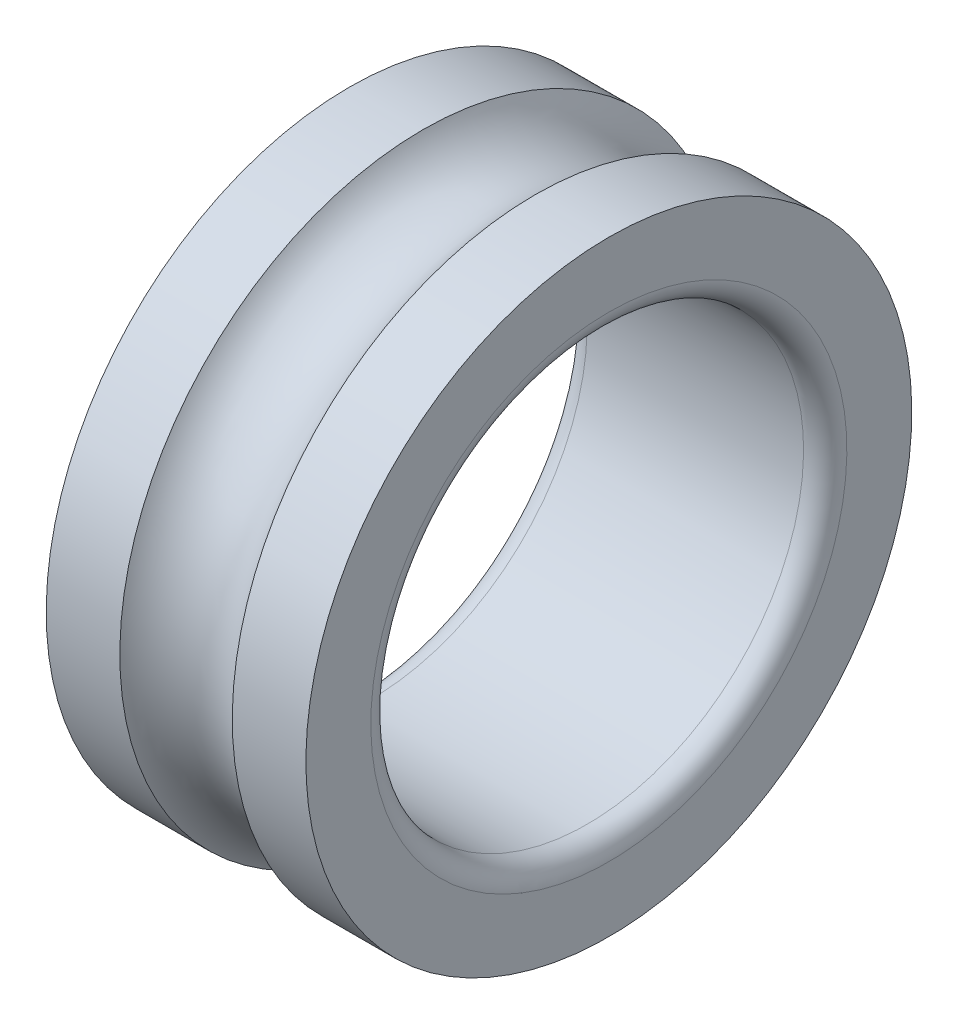
ISO-10303-21;
HEADER;
FILE_DESCRIPTION(('STEP AP214'),'2;1');
FILE_NAME('part.step','',(''),(''),'','','');
FILE_SCHEMA(('AUTOMOTIVE_DESIGN { 1 0 10303 214 1 1 1 1 }'));
ENDSEC;
DATA;
#1=APPLICATION_CONTEXT('core data for automotive mechanical design processes');
#2=APPLICATION_PROTOCOL_DEFINITION('international standard','automotive_design',2000,#1);
#3=PRODUCT_CONTEXT('',#1,'mechanical');
#4=PRODUCT('Part','Part','',(#3));
#5=PRODUCT_RELATED_PRODUCT_CATEGORY('part','',(#4));
#6=PRODUCT_DEFINITION_FORMATION('','',#4);
#7=PRODUCT_DEFINITION_CONTEXT('part definition',#1,'design');
#8=PRODUCT_DEFINITION('design','',#6,#7);
#9=PRODUCT_DEFINITION_SHAPE('','',#8);
#10=(LENGTH_UNIT() NAMED_UNIT(*) SI_UNIT(.MILLI.,.METRE.));
#11=(NAMED_UNIT(*) PLANE_ANGLE_UNIT() SI_UNIT($,.RADIAN.));
#12=(NAMED_UNIT(*) SI_UNIT($,.STERADIAN.) SOLID_ANGLE_UNIT());
#13=UNCERTAINTY_MEASURE_WITH_UNIT(LENGTH_MEASURE(1.E-05),#10,'distance_accuracy_value','');
#14=(GEOMETRIC_REPRESENTATION_CONTEXT(3) GLOBAL_UNCERTAINTY_ASSIGNED_CONTEXT((#13)) GLOBAL_UNIT_ASSIGNED_CONTEXT((#10,
#11,#12)) REPRESENTATION_CONTEXT('',''));
#15=CARTESIAN_POINT('',(0.,0.,0.));
#16=DIRECTION('',(0.,0.,1.));
#17=DIRECTION('',(1.,0.,0.));
#18=AXIS2_PLACEMENT_3D('',#15,#16,#17);
#19=CARTESIAN_POINT('',(5.,98.5,0.));
#20=DIRECTION('',(1.,0.,0.));
#21=DIRECTION('',(0.,1.,0.));
#22=AXIS2_PLACEMENT_3D('',#19,#20,#21);
#23=PLANE('',#22);
#24=CARTESIAN_POINT('',(5.,87.5,0.));
#25=DIRECTION('',(1.,0.,0.));
#26=DIRECTION('',(0.,1.,0.));
#27=AXIS2_PLACEMENT_3D('',#24,#25,#26);
#28=CIRCLE('',#27,14.);
#29=CARTESIAN_POINT('',(5.,101.5,0.));
#30=VERTEX_POINT('',#29);
#31=EDGE_CURVE('E10',#30,#30,#28,.T.);
#32=ORIENTED_EDGE('',*,*,#31,.T.);
#33=EDGE_LOOP('',(#32));
#34=FACE_BOUND('',#33,.T.);
#35=CARTESIAN_POINT('',(4.99999999999999,87.5,0.));
#36=DIRECTION('',(1.,0.,0.));
#37=DIRECTION('',(0.,1.,0.));
#38=AXIS2_PLACEMENT_3D('',#35,#36,#37);
#39=CIRCLE('',#38,11.);
#40=CARTESIAN_POINT('',(4.99999999999999,98.5,0.));
#41=VERTEX_POINT('',#40);
#42=EDGE_CURVE('E59',#41,#41,#39,.T.);
#43=ORIENTED_EDGE('',*,*,#42,.F.);
#44=EDGE_LOOP('',(#43));
#45=FACE_BOUND('',#44,.T.);
#46=ADVANCED_FACE('F31',(#34,#45),#23,.T.);
#47=CARTESIAN_POINT('',(20.,87.5,0.));
#48=DIRECTION('',(1.,0.,0.));
#49=DIRECTION('',(0.,1.,0.));
#50=AXIS2_PLACEMENT_3D('',#47,#48,#49);
#51=CYLINDRICAL_SURFACE('',#50,14.);
#52=CARTESIAN_POINT('',(1.59807621135331,87.5,0.));
#53=DIRECTION('',(1.,0.,0.));
#54=DIRECTION('',(0.,1.,0.));
#55=AXIS2_PLACEMENT_3D('',#52,#53,#54);
#56=CIRCLE('',#55,14.);
#57=CARTESIAN_POINT('',(1.59807621135332,101.5,0.));
#58=VERTEX_POINT('',#57);
#59=EDGE_CURVE('E37',#58,#58,#56,.T.);
#60=ORIENTED_EDGE('',*,*,#59,.T.);
#61=EDGE_LOOP('',(#60));
#62=FACE_BOUND('',#61,.T.);
#63=ORIENTED_EDGE('',*,*,#31,.F.);
#64=EDGE_LOOP('',(#63));
#65=FACE_BOUND('',#64,.T.);
#66=ADVANCED_FACE('F67',(#62,#65),#51,.T.);
#67=CARTESIAN_POINT('',(-1.,87.5,0.));
#68=DIRECTION('',(1.,0.,0.));
#69=DIRECTION('',(0.,1.,0.));
#70=AXIS2_PLACEMENT_3D('',#67,#68,#69);
#71=TOROIDAL_SURFACE('',#70,15.5,3.);
#72=CARTESIAN_POINT('',(-3.59807621135332,87.5,0.));
#73=DIRECTION('',(1.,0.,0.));
#74=DIRECTION('',(0.,1.,0.));
#75=AXIS2_PLACEMENT_3D('',#72,#73,#74);
#76=CIRCLE('',#75,14.);
#77=CARTESIAN_POINT('',(-3.59807621135331,101.5,0.));
#78=VERTEX_POINT('',#77);
#79=EDGE_CURVE('E41',#78,#78,#76,.T.);
#80=ORIENTED_EDGE('',*,*,#79,.T.);
#81=EDGE_LOOP('',(#80));
#82=FACE_BOUND('',#81,.T.);
#83=ORIENTED_EDGE('',*,*,#59,.F.);
#84=EDGE_LOOP('',(#83));
#85=FACE_BOUND('',#84,.T.);
#86=ADVANCED_FACE('F71',(#82,#85),#71,.F.);
#87=CARTESIAN_POINT('',(20.,87.5,0.));
#88=DIRECTION('',(1.,0.,0.));
#89=DIRECTION('',(0.,1.,0.));
#90=AXIS2_PLACEMENT_3D('',#87,#88,#89);
#91=CYLINDRICAL_SURFACE('',#90,14.);
#92=CARTESIAN_POINT('',(-7.,87.5,0.));
#93=DIRECTION('',(1.,0.,0.));
#94=DIRECTION('',(0.,1.,0.));
#95=AXIS2_PLACEMENT_3D('',#92,#93,#94);
#96=CIRCLE('',#95,14.);
#97=CARTESIAN_POINT('',(-7.,101.5,0.));
#98=VERTEX_POINT('',#97);
#99=EDGE_CURVE('E45',#98,#98,#96,.T.);
#100=ORIENTED_EDGE('',*,*,#99,.T.);
#101=EDGE_LOOP('',(#100));
#102=FACE_BOUND('',#101,.T.);
#103=ORIENTED_EDGE('',*,*,#79,.F.);
#104=EDGE_LOOP('',(#103));
#105=FACE_BOUND('',#104,.T.);
#106=ADVANCED_FACE('F75',(#102,#105),#91,.T.);
#107=CARTESIAN_POINT('',(-7.,98.5,0.));
#108=DIRECTION('',(-1.,0.,0.));
#109=DIRECTION('',(0.,-1.,0.));
#110=AXIS2_PLACEMENT_3D('',#107,#108,#109);
#111=PLANE('',#110);
#112=CARTESIAN_POINT('',(-7.,87.5,0.));
#113=DIRECTION('',(1.,0.,0.));
#114=DIRECTION('',(0.,1.,0.));
#115=AXIS2_PLACEMENT_3D('',#112,#113,#114);
#116=CIRCLE('',#115,11.);
#117=CARTESIAN_POINT('',(-7.,98.5,0.));
#118=VERTEX_POINT('',#117);
#119=EDGE_CURVE('E50',#118,#118,#116,.T.);
#120=ORIENTED_EDGE('',*,*,#119,.T.);
#121=EDGE_LOOP('',(#120));
#122=FACE_BOUND('',#121,.T.);
#123=ORIENTED_EDGE('',*,*,#99,.F.);
#124=EDGE_LOOP('',(#123));
#125=FACE_BOUND('',#124,.T.);
#126=ADVANCED_FACE('F82',(#122,#125),#111,.T.);
#127=CARTESIAN_POINT('',(-6.,87.5,0.));
#128=DIRECTION('',(1.,0.,0.));
#129=DIRECTION('',(0.,1.,0.));
#130=AXIS2_PLACEMENT_3D('',#127,#128,#129);
#131=TOROIDAL_SURFACE('',#130,11.,1.);
#132=CARTESIAN_POINT('',(-6.,87.5,0.));
#133=DIRECTION('',(1.,0.,0.));
#134=DIRECTION('',(0.,1.,0.));
#135=AXIS2_PLACEMENT_3D('',#132,#133,#134);
#136=CIRCLE('',#135,9.99999999999998);
#137=CARTESIAN_POINT('',(-5.99999999999999,97.5,0.));
#138=VERTEX_POINT('',#137);
#139=EDGE_CURVE('E53',#138,#138,#136,.T.);
#140=ORIENTED_EDGE('',*,*,#139,.T.);
#141=EDGE_LOOP('',(#140));
#142=FACE_BOUND('',#141,.T.);
#143=ORIENTED_EDGE('',*,*,#119,.F.);
#144=EDGE_LOOP('',(#143));
#145=FACE_BOUND('',#144,.T.);
#146=ADVANCED_FACE('F86',(#142,#145),#131,.T.);
#147=CARTESIAN_POINT('',(20.,87.5,0.));
#148=DIRECTION('',(1.,0.,0.));
#149=DIRECTION('',(0.,1.,0.));
#150=AXIS2_PLACEMENT_3D('',#147,#148,#149);
#151=CYLINDRICAL_SURFACE('',#150,9.99999999999999);
#152=CARTESIAN_POINT('',(4.,87.5,0.));
#153=DIRECTION('',(1.,0.,0.));
#154=DIRECTION('',(0.,1.,0.));
#155=AXIS2_PLACEMENT_3D('',#152,#153,#154);
#156=CIRCLE('',#155,10.);
#157=CARTESIAN_POINT('',(4.00000000000001,97.5,0.));
#158=VERTEX_POINT('',#157);
#159=EDGE_CURVE('E56',#158,#158,#156,.T.);
#160=ORIENTED_EDGE('',*,*,#159,.T.);
#161=EDGE_LOOP('',(#160));
#162=FACE_BOUND('',#161,.T.);
#163=ORIENTED_EDGE('',*,*,#139,.F.);
#164=EDGE_LOOP('',(#163));
#165=FACE_BOUND('',#164,.T.);
#166=ADVANCED_FACE('F90',(#162,#165),#151,.F.);
#167=CARTESIAN_POINT('',(4.,87.5,0.));
#168=DIRECTION('',(1.,0.,0.));
#169=DIRECTION('',(0.,1.,0.));
#170=AXIS2_PLACEMENT_3D('',#167,#168,#169);
#171=TOROIDAL_SURFACE('',#170,11.,0.999999999999987);
#172=ORIENTED_EDGE('',*,*,#42,.T.);
#173=EDGE_LOOP('',(#172));
#174=FACE_BOUND('',#173,.T.);
#175=ORIENTED_EDGE('',*,*,#159,.F.);
#176=EDGE_LOOP('',(#175));
#177=FACE_BOUND('',#176,.T.);
#178=ADVANCED_FACE('F63',(#174,#177),#171,.T.);
#179=CLOSED_SHELL('',(#46,#66,#86,#106,#126,#146,#166,#178));
#180=MANIFOLD_SOLID_BREP('B2',#179);
#181=ADVANCED_BREP_SHAPE_REPRESENTATION('',(#18,#180),#14);
#182=SHAPE_DEFINITION_REPRESENTATION(#9,#181);
ENDSEC;
END-ISO-10303-21;
